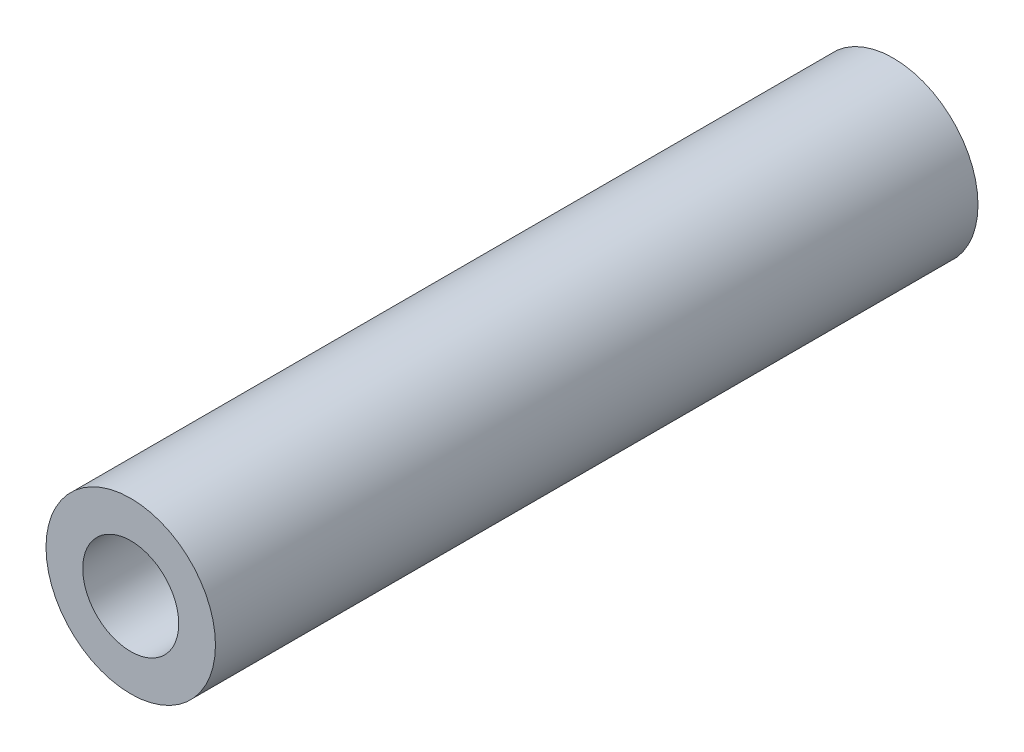
ISO-10303-21;
HEADER;
FILE_DESCRIPTION(('STEP AP214'),'2;1');
FILE_NAME('part.step','',(''),(''),'','','');
FILE_SCHEMA(('AUTOMOTIVE_DESIGN { 1 0 10303 214 1 1 1 1 }'));
ENDSEC;
DATA;
#1=APPLICATION_CONTEXT('core data for automotive mechanical design processes');
#2=APPLICATION_PROTOCOL_DEFINITION('international standard','automotive_design',2000,#1);
#3=PRODUCT_CONTEXT('',#1,'mechanical');
#4=PRODUCT('Part','Part','',(#3));
#5=PRODUCT_RELATED_PRODUCT_CATEGORY('part','',(#4));
#6=PRODUCT_DEFINITION_FORMATION('','',#4);
#7=PRODUCT_DEFINITION_CONTEXT('part definition',#1,'design');
#8=PRODUCT_DEFINITION('design','',#6,#7);
#9=PRODUCT_DEFINITION_SHAPE('','',#8);
#10=(LENGTH_UNIT() NAMED_UNIT(*) SI_UNIT(.MILLI.,.METRE.));
#11=(NAMED_UNIT(*) PLANE_ANGLE_UNIT() SI_UNIT($,.RADIAN.));
#12=(NAMED_UNIT(*) SI_UNIT($,.STERADIAN.) SOLID_ANGLE_UNIT());
#13=UNCERTAINTY_MEASURE_WITH_UNIT(LENGTH_MEASURE(1.E-05),#10,'distance_accuracy_value','');
#14=(GEOMETRIC_REPRESENTATION_CONTEXT(3) GLOBAL_UNCERTAINTY_ASSIGNED_CONTEXT((#13)) GLOBAL_UNIT_ASSIGNED_CONTEXT((#10,
#11,#12)) REPRESENTATION_CONTEXT('',''));
#15=CARTESIAN_POINT('',(0.,0.,0.));
#16=DIRECTION('',(0.,0.,1.));
#17=DIRECTION('',(1.,0.,0.));
#18=AXIS2_PLACEMENT_3D('',#15,#16,#17);
#19=CARTESIAN_POINT('',(0.,0.,27.));
#20=DIRECTION('',(0.,0.,1.));
#21=DIRECTION('',(1.,0.,0.));
#22=AXIS2_PLACEMENT_3D('',#19,#20,#21);
#23=PLANE('',#22);
#24=CARTESIAN_POINT('',(0.,0.,27.));
#25=DIRECTION('',(0.,0.,1.));
#26=DIRECTION('',(1.,0.,0.));
#27=AXIS2_PLACEMENT_3D('',#24,#25,#26);
#28=CIRCLE('',#27,3.);
#29=CARTESIAN_POINT('',(3.,0.,27.));
#30=VERTEX_POINT('',#29);
#31=EDGE_CURVE('E10',#30,#30,#28,.T.);
#32=ORIENTED_EDGE('',*,*,#31,.T.);
#33=EDGE_LOOP('',(#32));
#34=FACE_BOUND('',#33,.T.);
#35=CARTESIAN_POINT('',(0.,0.,27.));
#36=DIRECTION('',(0.,0.,1.));
#37=DIRECTION('',(1.,0.,0.));
#38=AXIS2_PLACEMENT_3D('',#35,#36,#37);
#39=CIRCLE('',#38,1.7);
#40=CARTESIAN_POINT('',(1.7,0.,27.));
#41=VERTEX_POINT('',#40);
#42=EDGE_CURVE('E48',#41,#41,#39,.T.);
#43=ORIENTED_EDGE('',*,*,#42,.F.);
#44=EDGE_LOOP('',(#43));
#45=FACE_BOUND('',#44,.T.);
#46=ADVANCED_FACE('F40',(#34,#45),#23,.T.);
#47=CARTESIAN_POINT('',(0.,0.,0.));
#48=DIRECTION('',(0.,0.,1.));
#49=DIRECTION('',(1.,0.,0.));
#50=AXIS2_PLACEMENT_3D('',#47,#48,#49);
#51=PLANE('',#50);
#52=CARTESIAN_POINT('',(0.,0.,0.));
#53=DIRECTION('',(0.,0.,1.));
#54=DIRECTION('',(1.,0.,0.));
#55=AXIS2_PLACEMENT_3D('',#52,#53,#54);
#56=CIRCLE('',#55,3.);
#57=CARTESIAN_POINT('',(3.,0.,0.));
#58=VERTEX_POINT('',#57);
#59=EDGE_CURVE('E41',#58,#58,#56,.T.);
#60=ORIENTED_EDGE('',*,*,#59,.F.);
#61=EDGE_LOOP('',(#60));
#62=FACE_BOUND('',#61,.T.);
#63=CARTESIAN_POINT('',(0.,0.,0.));
#64=DIRECTION('',(0.,0.,1.));
#65=DIRECTION('',(1.,0.,0.));
#66=AXIS2_PLACEMENT_3D('',#63,#64,#65);
#67=CIRCLE('',#66,1.7);
#68=CARTESIAN_POINT('',(1.7,0.,0.));
#69=VERTEX_POINT('',#68);
#70=EDGE_CURVE('E49',#69,#69,#67,.T.);
#71=ORIENTED_EDGE('',*,*,#70,.T.);
#72=EDGE_LOOP('',(#71));
#73=FACE_BOUND('',#72,.T.);
#74=ADVANCED_FACE('F58',(#62,#73),#51,.F.);
#75=CARTESIAN_POINT('',(0.,0.,27.));
#76=DIRECTION('',(0.,0.,-1.));
#77=DIRECTION('',(-1.,0.,0.));
#78=AXIS2_PLACEMENT_3D('',#75,#76,#77);
#79=CYLINDRICAL_SURFACE('',#78,3.);
#80=ORIENTED_EDGE('',*,*,#31,.F.);
#81=EDGE_LOOP('',(#80));
#82=FACE_BOUND('',#81,.T.);
#83=ORIENTED_EDGE('',*,*,#59,.T.);
#84=EDGE_LOOP('',(#83));
#85=FACE_BOUND('',#84,.T.);
#86=ADVANCED_FACE('F39',(#82,#85),#79,.T.);
#87=CARTESIAN_POINT('',(0.,0.,27.));
#88=DIRECTION('',(0.,0.,-1.));
#89=DIRECTION('',(-1.,0.,0.));
#90=AXIS2_PLACEMENT_3D('',#87,#88,#89);
#91=CYLINDRICAL_SURFACE('',#90,1.7);
#92=ORIENTED_EDGE('',*,*,#42,.T.);
#93=EDGE_LOOP('',(#92));
#94=FACE_BOUND('',#93,.T.);
#95=ORIENTED_EDGE('',*,*,#70,.F.);
#96=EDGE_LOOP('',(#95));
#97=FACE_BOUND('',#96,.T.);
#98=ADVANCED_FACE('F57',(#94,#97),#91,.F.);
#99=CLOSED_SHELL('',(#46,#74,#86,#98));
#100=MANIFOLD_SOLID_BREP('B2',#99);
#101=ADVANCED_BREP_SHAPE_REPRESENTATION('',(#18,#100),#14);
#102=SHAPE_DEFINITION_REPRESENTATION(#9,#101);
ENDSEC;
END-ISO-10303-21;
